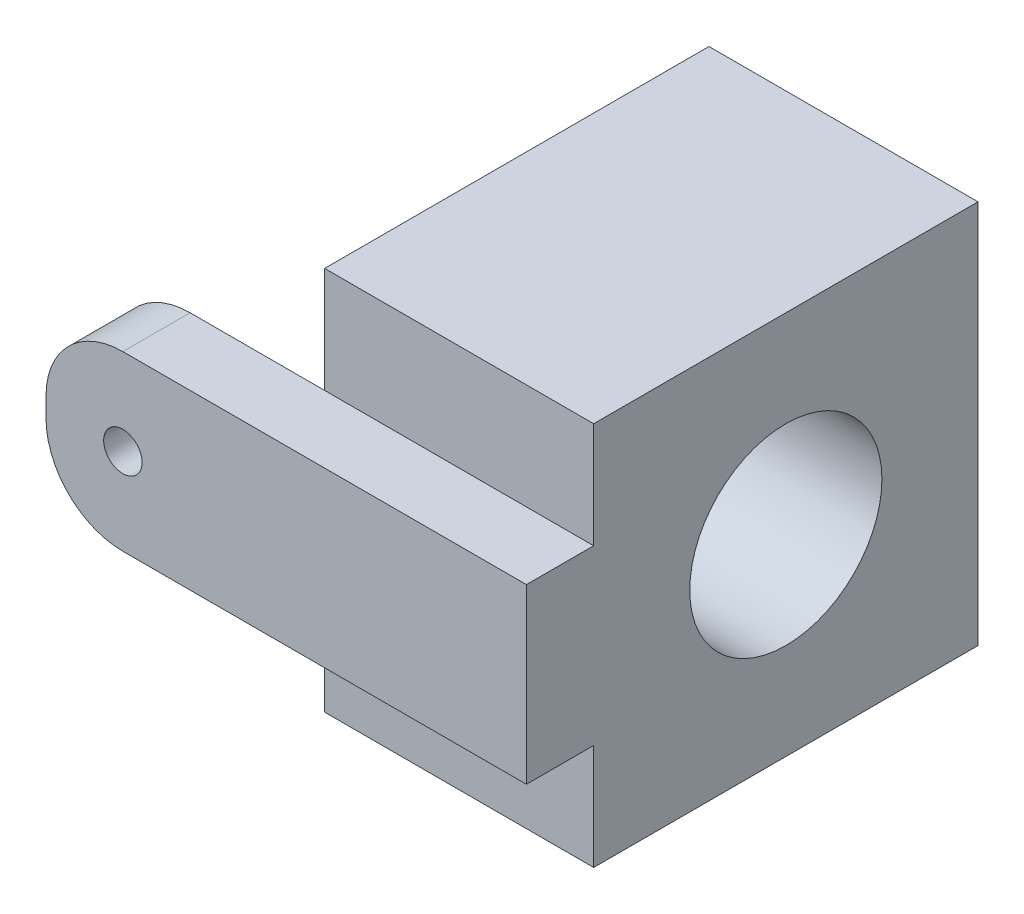
ISO-10303-21;
HEADER;
FILE_DESCRIPTION(('STEP AP214'),'2;1');
FILE_NAME('part.step','',(''),(''),'','','');
FILE_SCHEMA(('AUTOMOTIVE_DESIGN { 1 0 10303 214 1 1 1 1 }'));
ENDSEC;
DATA;
#1=APPLICATION_CONTEXT('core data for automotive mechanical design processes');
#2=APPLICATION_PROTOCOL_DEFINITION('international standard','automotive_design',2000,#1);
#3=PRODUCT_CONTEXT('',#1,'mechanical');
#4=PRODUCT('Part','Part','',(#3));
#5=PRODUCT_RELATED_PRODUCT_CATEGORY('part','',(#4));
#6=PRODUCT_DEFINITION_FORMATION('','',#4);
#7=PRODUCT_DEFINITION_CONTEXT('part definition',#1,'design');
#8=PRODUCT_DEFINITION('design','',#6,#7);
#9=PRODUCT_DEFINITION_SHAPE('','',#8);
#10=(LENGTH_UNIT() NAMED_UNIT(*) SI_UNIT(.MILLI.,.METRE.));
#11=(NAMED_UNIT(*) PLANE_ANGLE_UNIT() SI_UNIT($,.RADIAN.));
#12=(NAMED_UNIT(*) SI_UNIT($,.STERADIAN.) SOLID_ANGLE_UNIT());
#13=UNCERTAINTY_MEASURE_WITH_UNIT(LENGTH_MEASURE(1.E-05),#10,'distance_accuracy_value','');
#14=(GEOMETRIC_REPRESENTATION_CONTEXT(3) GLOBAL_UNCERTAINTY_ASSIGNED_CONTEXT((#13)) GLOBAL_UNIT_ASSIGNED_CONTEXT((#10,
#11,#12)) REPRESENTATION_CONTEXT('',''));
#15=CARTESIAN_POINT('',(0.,0.,0.));
#16=DIRECTION('',(0.,0.,1.));
#17=DIRECTION('',(1.,0.,0.));
#18=AXIS2_PLACEMENT_3D('',#15,#16,#17);
#19=CARTESIAN_POINT('',(14.,-20.,20.));
#20=DIRECTION('',(0.,0.,1.));
#21=DIRECTION('',(1.,0.,0.));
#22=AXIS2_PLACEMENT_3D('',#19,#20,#21);
#23=PLANE('',#22);
#24=DIRECTION('',(1.,0.,0.));
#25=VECTOR('',#24,1.);
#26=CARTESIAN_POINT('',(14.,-9.,20.));
#27=LINE('',#26,#25);
#28=CARTESIAN_POINT('',(-14.,-9.,20.));
#29=VERTEX_POINT('',#28);
#30=CARTESIAN_POINT('',(14.,-9.,20.));
#31=VERTEX_POINT('',#30);
#32=EDGE_CURVE('E199',#29,#31,#27,.T.);
#33=ORIENTED_EDGE('',*,*,#32,.F.);
#34=DIRECTION('',(0.,1.,0.));
#35=VECTOR('',#34,1.);
#36=CARTESIAN_POINT('',(-14.,-20.,20.));
#37=LINE('',#36,#35);
#38=CARTESIAN_POINT('',(-14.,-20.,20.));
#39=VERTEX_POINT('',#38);
#40=EDGE_CURVE('E200',#39,#29,#37,.T.);
#41=ORIENTED_EDGE('',*,*,#40,.F.);
#42=DIRECTION('',(1.,0.,0.));
#43=VECTOR('',#42,1.);
#44=CARTESIAN_POINT('',(14.,-20.,20.));
#45=LINE('',#44,#43);
#46=CARTESIAN_POINT('',(14.,-20.,20.));
#47=VERTEX_POINT('',#46);
#48=EDGE_CURVE('E191',#39,#47,#45,.T.);
#49=ORIENTED_EDGE('',*,*,#48,.T.);
#50=DIRECTION('',(0.,1.,0.));
#51=VECTOR('',#50,1.);
#52=CARTESIAN_POINT('',(14.,-20.,20.));
#53=LINE('',#52,#51);
#54=EDGE_CURVE('E196',#47,#31,#53,.T.);
#55=ORIENTED_EDGE('',*,*,#54,.T.);
#56=EDGE_LOOP('',(#33,#41,#49,#55));
#57=FACE_BOUND('',#56,.T.);
#58=ADVANCED_FACE('F39',(#57),#23,.T.);
#59=CARTESIAN_POINT('',(14.,-20.,-20.));
#60=DIRECTION('',(1.,0.,0.));
#61=DIRECTION('',(0.,0.,-1.));
#62=AXIS2_PLACEMENT_3D('',#59,#60,#61);
#63=PLANE('',#62);
#64=CARTESIAN_POINT('',(14.,0.,0.));
#65=DIRECTION('',(1.,0.,0.));
#66=DIRECTION('',(0.,0.,-1.));
#67=AXIS2_PLACEMENT_3D('',#64,#65,#66);
#68=CIRCLE('',#67,10.);
#69=CARTESIAN_POINT('',(14.,0.,-10.));
#70=VERTEX_POINT('',#69);
#71=EDGE_CURVE('E149',#70,#70,#68,.T.);
#72=ORIENTED_EDGE('',*,*,#71,.F.);
#73=EDGE_LOOP('',(#72));
#74=FACE_BOUND('',#73,.T.);
#75=DIRECTION('',(0.,1.,0.));
#76=VECTOR('',#75,1.);
#77=CARTESIAN_POINT('',(14.,-20.,-20.));
#78=LINE('',#77,#76);
#79=CARTESIAN_POINT('',(14.,-20.,-20.));
#80=VERTEX_POINT('',#79);
#81=CARTESIAN_POINT('',(14.,20.,-20.));
#82=VERTEX_POINT('',#81);
#83=EDGE_CURVE('E195',#80,#82,#78,.T.);
#84=ORIENTED_EDGE('',*,*,#83,.T.);
#85=DIRECTION('',(0.,0.,-1.));
#86=VECTOR('',#85,1.);
#87=CARTESIAN_POINT('',(14.,20.,-20.));
#88=LINE('',#87,#86);
#89=CARTESIAN_POINT('',(14.,20.,20.));
#90=VERTEX_POINT('',#89);
#91=EDGE_CURVE('E162',#90,#82,#88,.T.);
#92=ORIENTED_EDGE('',*,*,#91,.F.);
#93=CARTESIAN_POINT('',(14.,9.,20.));
#94=VERTEX_POINT('',#93);
#95=EDGE_CURVE('E147',#94,#90,#53,.T.);
#96=ORIENTED_EDGE('',*,*,#95,.F.);
#97=DIRECTION('',(0.,0.,-1.));
#98=VECTOR('',#97,1.);
#99=CARTESIAN_POINT('',(14.,9.,27.));
#100=LINE('',#99,#98);
#101=CARTESIAN_POINT('',(14.,9.,27.));
#102=VERTEX_POINT('',#101);
#103=EDGE_CURVE('E127',#102,#94,#100,.T.);
#104=ORIENTED_EDGE('',*,*,#103,.F.);
#105=DIRECTION('',(0.,1.,0.));
#106=VECTOR('',#105,1.);
#107=CARTESIAN_POINT('',(14.,9.,27.));
#108=LINE('',#107,#106);
#109=CARTESIAN_POINT('',(14.,-9.,27.));
#110=VERTEX_POINT('',#109);
#111=EDGE_CURVE('E132',#110,#102,#108,.T.);
#112=ORIENTED_EDGE('',*,*,#111,.F.);
#113=DIRECTION('',(0.,0.,-1.));
#114=VECTOR('',#113,1.);
#115=CARTESIAN_POINT('',(14.,-9.,27.));
#116=LINE('',#115,#114);
#117=EDGE_CURVE('E150',#110,#31,#116,.T.);
#118=ORIENTED_EDGE('',*,*,#117,.T.);
#119=ORIENTED_EDGE('',*,*,#54,.F.);
#120=DIRECTION('',(0.,0.,-1.));
#121=VECTOR('',#120,1.);
#122=CARTESIAN_POINT('',(14.,-20.,-20.));
#123=LINE('',#122,#121);
#124=EDGE_CURVE('E179',#47,#80,#123,.T.);
#125=ORIENTED_EDGE('',*,*,#124,.T.);
#126=EDGE_LOOP('',(#84,#92,#96,#104,#112,#118,#119,#125));
#127=FACE_BOUND('',#126,.T.);
#128=ADVANCED_FACE('F145',(#74,#127),#63,.T.);
#129=DIRECTION('',(-1.,0.,0.));
#130=VECTOR('',#129,1.);
#131=CARTESIAN_POINT('',(14.,9.,20.));
#132=LINE('',#131,#130);
#133=CARTESIAN_POINT('',(-14.,9.,20.));
#134=VERTEX_POINT('',#133);
#135=EDGE_CURVE('E248',#94,#134,#132,.T.);
#136=ORIENTED_EDGE('',*,*,#135,.F.);
#137=ORIENTED_EDGE('',*,*,#95,.T.);
#138=DIRECTION('',(1.,0.,0.));
#139=VECTOR('',#138,1.);
#140=CARTESIAN_POINT('',(14.,20.,20.));
#141=LINE('',#140,#139);
#142=CARTESIAN_POINT('',(-14.,20.,20.));
#143=VERTEX_POINT('',#142);
#144=EDGE_CURVE('E175',#143,#90,#141,.T.);
#145=ORIENTED_EDGE('',*,*,#144,.F.);
#146=EDGE_CURVE('E205',#134,#143,#37,.T.);
#147=ORIENTED_EDGE('',*,*,#146,.F.);
#148=EDGE_LOOP('',(#136,#137,#145,#147));
#149=FACE_BOUND('',#148,.T.);
#150=ADVANCED_FACE('F281',(#149),#23,.T.);
#151=CARTESIAN_POINT('',(-14.,-20.,-20.));
#152=DIRECTION('',(-1.,0.,0.));
#153=DIRECTION('',(0.,0.,1.));
#154=AXIS2_PLACEMENT_3D('',#151,#152,#153);
#155=PLANE('',#154);
#156=CARTESIAN_POINT('',(-14.,0.,0.));
#157=DIRECTION('',(1.,0.,0.));
#158=DIRECTION('',(0.,0.,-1.));
#159=AXIS2_PLACEMENT_3D('',#156,#157,#158);
#160=CIRCLE('',#159,10.);
#161=CARTESIAN_POINT('',(-14.,0.,-10.));
#162=VERTEX_POINT('',#161);
#163=EDGE_CURVE('E155',#162,#162,#160,.T.);
#164=ORIENTED_EDGE('',*,*,#163,.T.);
#165=EDGE_LOOP('',(#164));
#166=FACE_BOUND('',#165,.T.);
#167=ORIENTED_EDGE('',*,*,#40,.T.);
#168=EDGE_CURVE('E204',#29,#134,#37,.T.);
#169=ORIENTED_EDGE('',*,*,#168,.T.);
#170=ORIENTED_EDGE('',*,*,#146,.T.);
#171=DIRECTION('',(0.,0.,1.));
#172=VECTOR('',#171,1.);
#173=CARTESIAN_POINT('',(-14.,20.,-20.));
#174=LINE('',#173,#172);
#175=CARTESIAN_POINT('',(-14.,20.,-20.));
#176=VERTEX_POINT('',#175);
#177=EDGE_CURVE('E171',#176,#143,#174,.T.);
#178=ORIENTED_EDGE('',*,*,#177,.F.);
#179=DIRECTION('',(0.,1.,0.));
#180=VECTOR('',#179,1.);
#181=CARTESIAN_POINT('',(-14.,-20.,-20.));
#182=LINE('',#181,#180);
#183=CARTESIAN_POINT('',(-14.,-20.,-20.));
#184=VERTEX_POINT('',#183);
#185=EDGE_CURVE('E206',#184,#176,#182,.T.);
#186=ORIENTED_EDGE('',*,*,#185,.F.);
#187=DIRECTION('',(0.,0.,1.));
#188=VECTOR('',#187,1.);
#189=CARTESIAN_POINT('',(-14.,-20.,-20.));
#190=LINE('',#189,#188);
#191=EDGE_CURVE('E187',#184,#39,#190,.T.);
#192=ORIENTED_EDGE('',*,*,#191,.T.);
#193=EDGE_LOOP('',(#167,#169,#170,#178,#186,#192));
#194=FACE_BOUND('',#193,.T.);
#195=ADVANCED_FACE('F291',(#166,#194),#155,.T.);
#196=CARTESIAN_POINT('',(14.,-20.,-20.));
#197=DIRECTION('',(0.,0.,-1.));
#198=DIRECTION('',(-1.,0.,0.));
#199=AXIS2_PLACEMENT_3D('',#196,#197,#198);
#200=PLANE('',#199);
#201=ORIENTED_EDGE('',*,*,#185,.T.);
#202=DIRECTION('',(-1.,0.,0.));
#203=VECTOR('',#202,1.);
#204=CARTESIAN_POINT('',(14.,20.,-20.));
#205=LINE('',#204,#203);
#206=EDGE_CURVE('E167',#82,#176,#205,.T.);
#207=ORIENTED_EDGE('',*,*,#206,.F.);
#208=ORIENTED_EDGE('',*,*,#83,.F.);
#209=DIRECTION('',(-1.,0.,0.));
#210=VECTOR('',#209,1.);
#211=CARTESIAN_POINT('',(14.,-20.,-20.));
#212=LINE('',#211,#210);
#213=EDGE_CURVE('E183',#80,#184,#212,.T.);
#214=ORIENTED_EDGE('',*,*,#213,.T.);
#215=EDGE_LOOP('',(#201,#207,#208,#214));
#216=FACE_BOUND('',#215,.T.);
#217=ADVANCED_FACE('F296',(#216),#200,.T.);
#218=CARTESIAN_POINT('',(0.,-20.,0.));
#219=DIRECTION('',(0.,-1.,0.));
#220=DIRECTION('',(0.,0.,-1.));
#221=AXIS2_PLACEMENT_3D('',#218,#219,#220);
#222=PLANE('',#221);
#223=ORIENTED_EDGE('',*,*,#124,.F.);
#224=ORIENTED_EDGE('',*,*,#48,.F.);
#225=ORIENTED_EDGE('',*,*,#191,.F.);
#226=ORIENTED_EDGE('',*,*,#213,.F.);
#227=EDGE_LOOP('',(#223,#224,#225,#226));
#228=FACE_BOUND('',#227,.T.);
#229=ADVANCED_FACE('F311',(#228),#222,.T.);
#230=CARTESIAN_POINT('',(0.,20.,0.));
#231=DIRECTION('',(0.,-1.,0.));
#232=DIRECTION('',(0.,0.,-1.));
#233=AXIS2_PLACEMENT_3D('',#230,#231,#232);
#234=PLANE('',#233);
#235=ORIENTED_EDGE('',*,*,#91,.T.);
#236=ORIENTED_EDGE('',*,*,#206,.T.);
#237=ORIENTED_EDGE('',*,*,#177,.T.);
#238=ORIENTED_EDGE('',*,*,#144,.T.);
#239=EDGE_LOOP('',(#235,#236,#237,#238));
#240=FACE_BOUND('',#239,.T.);
#241=ADVANCED_FACE('F316',(#240),#234,.F.);
#242=CARTESIAN_POINT('',(-14.,0.,0.));
#243=DIRECTION('',(1.,0.,0.));
#244=DIRECTION('',(0.,0.,-1.));
#245=AXIS2_PLACEMENT_3D('',#242,#243,#244);
#246=CYLINDRICAL_SURFACE('',#245,10.);
#247=CARTESIAN_POINT('',(-14.,0.,-10.));
#248=CARTESIAN_POINT('',(-13.7083333333333,0.,-10.));
#249=CARTESIAN_POINT('',(-13.4166666666667,0.,-10.));
#250=CARTESIAN_POINT('',(-12.8333333333333,0.,-10.));
#251=CARTESIAN_POINT('',(-12.5416666666667,0.,-10.));
#252=CARTESIAN_POINT('',(-11.9583333333333,0.,-10.));
#253=CARTESIAN_POINT('',(-11.6666666666667,0.,-10.));
#254=CARTESIAN_POINT('',(-11.0833333333333,0.,-10.));
#255=CARTESIAN_POINT('',(-10.7916666666667,0.,-10.));
#256=CARTESIAN_POINT('',(-10.2083333333333,0.,-10.));
#257=CARTESIAN_POINT('',(-9.91666666666667,0.,-10.));
#258=CARTESIAN_POINT('',(-9.33333333333333,0.,-10.));
#259=CARTESIAN_POINT('',(-9.04166666666667,0.,-10.));
#260=CARTESIAN_POINT('',(-8.45833333333333,0.,-10.));
#261=CARTESIAN_POINT('',(-8.16666666666667,0.,-10.));
#262=CARTESIAN_POINT('',(-7.58333333333333,0.,-10.));
#263=CARTESIAN_POINT('',(-7.29166666666667,0.,-10.));
#264=CARTESIAN_POINT('',(-6.70833333333333,0.,-10.));
#265=CARTESIAN_POINT('',(-6.41666666666667,0.,-10.));
#266=CARTESIAN_POINT('',(-5.83333333333334,0.,-10.));
#267=CARTESIAN_POINT('',(-5.54166666666667,0.,-10.));
#268=CARTESIAN_POINT('',(-4.95833333333334,0.,-10.));
#269=CARTESIAN_POINT('',(-4.66666666666667,0.,-10.));
#270=CARTESIAN_POINT('',(-4.08333333333334,0.,-10.));
#271=CARTESIAN_POINT('',(-3.79166666666667,0.,-10.));
#272=CARTESIAN_POINT('',(-3.20833333333334,0.,-10.));
#273=CARTESIAN_POINT('',(-2.91666666666667,0.,-10.));
#274=CARTESIAN_POINT('',(-2.33333333333334,0.,-10.));
#275=CARTESIAN_POINT('',(-2.04166666666667,0.,-10.));
#276=CARTESIAN_POINT('',(-1.45833333333334,0.,-10.));
#277=CARTESIAN_POINT('',(-1.16666666666667,0.,-10.));
#278=CARTESIAN_POINT('',(-0.583333333333337,0.,-10.));
#279=CARTESIAN_POINT('',(-0.29166666666667,0.,-10.));
#280=CARTESIAN_POINT('',(0.291666666666663,0.,-10.));
#281=CARTESIAN_POINT('',(0.58333333333333,0.,-10.));
#282=CARTESIAN_POINT('',(1.16666666666666,0.,-10.));
#283=CARTESIAN_POINT('',(1.45833333333333,0.,-10.));
#284=CARTESIAN_POINT('',(2.04166666666666,0.,-10.));
#285=CARTESIAN_POINT('',(2.33333333333333,0.,-10.));
#286=CARTESIAN_POINT('',(2.91666666666666,0.,-10.));
#287=CARTESIAN_POINT('',(3.20833333333333,0.,-10.));
#288=CARTESIAN_POINT('',(3.79166666666666,0.,-10.));
#289=CARTESIAN_POINT('',(4.08333333333333,0.,-10.));
#290=CARTESIAN_POINT('',(4.66666666666666,0.,-10.));
#291=CARTESIAN_POINT('',(4.95833333333333,0.,-10.));
#292=CARTESIAN_POINT('',(5.54166666666666,0.,-10.));
#293=CARTESIAN_POINT('',(5.83333333333333,0.,-10.));
#294=CARTESIAN_POINT('',(6.41666666666666,0.,-10.));
#295=CARTESIAN_POINT('',(6.70833333333333,0.,-10.));
#296=CARTESIAN_POINT('',(7.29166666666666,0.,-10.));
#297=CARTESIAN_POINT('',(7.58333333333333,0.,-10.));
#298=CARTESIAN_POINT('',(8.16666666666666,0.,-10.));
#299=CARTESIAN_POINT('',(8.45833333333333,0.,-10.));
#300=CARTESIAN_POINT('',(9.04166666666666,0.,-10.));
#301=CARTESIAN_POINT('',(9.33333333333333,0.,-10.));
#302=CARTESIAN_POINT('',(9.91666666666666,0.,-10.));
#303=CARTESIAN_POINT('',(10.2083333333333,0.,-10.));
#304=CARTESIAN_POINT('',(10.7916666666667,0.,-10.));
#305=CARTESIAN_POINT('',(11.0833333333333,0.,-10.));
#306=CARTESIAN_POINT('',(11.6666666666667,0.,-10.));
#307=CARTESIAN_POINT('',(11.9583333333333,0.,-10.));
#308=CARTESIAN_POINT('',(12.5416666666667,0.,-10.));
#309=CARTESIAN_POINT('',(12.8333333333333,0.,-10.));
#310=CARTESIAN_POINT('',(13.4166666666667,0.,-10.));
#311=CARTESIAN_POINT('',(13.7083333333333,0.,-10.));
#312=CARTESIAN_POINT('',(14.,0.,-10.));
#313=B_SPLINE_CURVE_WITH_KNOTS('',3,(#247,#248,#249,#250,#251,#252,#253,#254,#255,#256,#257,
#258,#259,#260,#261,#262,#263,#264,#265,#266,#267,#268,#269,#270,#271,#272,#273,#274,#275,#276,
#277,#278,#279,#280,#281,#282,#283,#284,#285,#286,#287,#288,#289,#290,#291,#292,#293,#294,#295,
#296,#297,#298,#299,#300,#301,#302,#303,#304,#305,#306,#307,#308,#309,#310,#311,#312),
.UNSPECIFIED.,.F.,.F.,(4,2,2,2,2,2,2,2,2,2,2,2,2,2,2,2,2,2,2,2,2,2,2,2,2,2,2,2,2,2,2,2,4),(0.,
0.875000000000001,1.75,2.625,3.5,4.375,5.25,6.125,7.,7.875,8.75,9.625,10.5,11.375,12.25,13.125,
14.,14.875,15.75,16.625,17.5,18.375,19.25,20.125,21.,21.875,22.75,23.625,24.5,25.375,26.25,
27.125,28.),.UNSPECIFIED.);
#314=EDGE_CURVE('BSEAM331',#162,#70,#313,.T.);
#315=ORIENTED_EDGE('',*,*,#163,.F.);
#316=ORIENTED_EDGE('',*,*,#71,.T.);
#317=ORIENTED_EDGE('',*,*,#314,.T.);
#318=ORIENTED_EDGE('',*,*,#314,.F.);
#319=EDGE_LOOP('',(#315,#317,#316,#318));
#320=FACE_BOUND('',#319,.T.);
#321=ADVANCED_FACE('F331',(#320),#246,.F.);
#322=CARTESIAN_POINT('',(0.,0.,20.));
#323=DIRECTION('',(0.,0.,-1.));
#324=DIRECTION('',(-1.,0.,0.));
#325=AXIS2_PLACEMENT_3D('',#322,#323,#324);
#326=PLANE('',#325);
#327=CARTESIAN_POINT('',(-28.,0.,20.));
#328=DIRECTION('',(0.,0.,-1.));
#329=DIRECTION('',(-1.,0.,0.));
#330=AXIS2_PLACEMENT_3D('',#327,#328,#329);
#331=CIRCLE('',#330,2.);
#332=CARTESIAN_POINT('',(-30.,0.,20.));
#333=VERTEX_POINT('',#332);
#334=EDGE_CURVE('E257',#333,#333,#331,.T.);
#335=ORIENTED_EDGE('',*,*,#334,.F.);
#336=EDGE_LOOP('',(#335));
#337=FACE_BOUND('',#336,.T.);
#338=CARTESIAN_POINT('',(-28.,-9.,20.));
#339=VERTEX_POINT('',#338);
#340=EDGE_CURVE('E142',#339,#29,#27,.T.);
#341=ORIENTED_EDGE('',*,*,#340,.F.);
#342=CARTESIAN_POINT('',(-28.,-0.999999999999999,20.));
#343=DIRECTION('',(0.,0.,-1.));
#344=DIRECTION('',(-1.,0.,0.));
#345=AXIS2_PLACEMENT_3D('',#342,#343,#344);
#346=CIRCLE('',#345,8.);
#347=CARTESIAN_POINT('',(-36.,-0.999999999999999,20.));
#348=VERTEX_POINT('',#347);
#349=EDGE_CURVE('E218',#339,#348,#346,.T.);
#350=ORIENTED_EDGE('',*,*,#349,.T.);
#351=DIRECTION('',(0.,-1.,0.));
#352=VECTOR('',#351,1.);
#353=CARTESIAN_POINT('',(-36.,9.,20.));
#354=LINE('',#353,#352);
#355=CARTESIAN_POINT('',(-36.,0.999999999999999,20.));
#356=VERTEX_POINT('',#355);
#357=EDGE_CURVE('E243',#356,#348,#354,.T.);
#358=ORIENTED_EDGE('',*,*,#357,.F.);
#359=CARTESIAN_POINT('',(-28.,0.999999999999999,20.));
#360=DIRECTION('',(0.,0.,-1.));
#361=DIRECTION('',(-1.,0.,0.));
#362=AXIS2_PLACEMENT_3D('',#359,#360,#361);
#363=CIRCLE('',#362,8.);
#364=CARTESIAN_POINT('',(-28.,9.,20.));
#365=VERTEX_POINT('',#364);
#366=EDGE_CURVE('E215',#356,#365,#363,.T.);
#367=ORIENTED_EDGE('',*,*,#366,.T.);
#368=EDGE_CURVE('E252',#134,#365,#132,.T.);
#369=ORIENTED_EDGE('',*,*,#368,.F.);
#370=ORIENTED_EDGE('',*,*,#168,.F.);
#371=EDGE_LOOP('',(#341,#350,#358,#367,#369,#370));
#372=FACE_BOUND('',#371,.T.);
#373=ADVANCED_FACE('F242',(#337,#372),#326,.T.);
#374=CARTESIAN_POINT('',(14.,9.,27.));
#375=DIRECTION('',(0.,-1.,0.));
#376=DIRECTION('',(0.,0.,-1.));
#377=AXIS2_PLACEMENT_3D('',#374,#375,#376);
#378=PLANE('',#377);
#379=ORIENTED_EDGE('',*,*,#368,.T.);
#380=DIRECTION('',(0.,0.,-1.));
#381=VECTOR('',#380,1.);
#382=CARTESIAN_POINT('',(-28.,9.,27.));
#383=LINE('',#382,#381);
#384=CARTESIAN_POINT('',(-28.,9.,27.));
#385=VERTEX_POINT('',#384);
#386=EDGE_CURVE('E11',#365,#385,#383,.F.);
#387=ORIENTED_EDGE('',*,*,#386,.T.);
#388=DIRECTION('',(-1.,0.,0.));
#389=VECTOR('',#388,1.);
#390=CARTESIAN_POINT('',(14.,9.,27.));
#391=LINE('',#390,#389);
#392=EDGE_CURVE('E122',#102,#385,#391,.T.);
#393=ORIENTED_EDGE('',*,*,#392,.F.);
#394=ORIENTED_EDGE('',*,*,#103,.T.);
#395=ORIENTED_EDGE('',*,*,#135,.T.);
#396=EDGE_LOOP('',(#379,#387,#393,#394,#395));
#397=FACE_BOUND('',#396,.T.);
#398=ADVANCED_FACE('F124',(#397),#378,.F.);
#399=CARTESIAN_POINT('',(-36.,9.,27.));
#400=DIRECTION('',(1.,0.,0.));
#401=DIRECTION('',(0.,0.,-1.));
#402=AXIS2_PLACEMENT_3D('',#399,#400,#401);
#403=PLANE('',#402);
#404=ORIENTED_EDGE('',*,*,#357,.T.);
#405=DIRECTION('',(0.,0.,-1.));
#406=VECTOR('',#405,1.);
#407=CARTESIAN_POINT('',(-36.,-0.999999999999999,27.));
#408=LINE('',#407,#406);
#409=CARTESIAN_POINT('',(-36.,-0.999999999999999,27.));
#410=VERTEX_POINT('',#409);
#411=EDGE_CURVE('E61',#348,#410,#408,.F.);
#412=ORIENTED_EDGE('',*,*,#411,.T.);
#413=DIRECTION('',(0.,-1.,0.));
#414=VECTOR('',#413,1.);
#415=CARTESIAN_POINT('',(-36.,9.,27.));
#416=LINE('',#415,#414);
#417=CARTESIAN_POINT('',(-36.,0.999999999999999,27.));
#418=VERTEX_POINT('',#417);
#419=EDGE_CURVE('E131',#418,#410,#416,.T.);
#420=ORIENTED_EDGE('',*,*,#419,.F.);
#421=DIRECTION('',(0.,0.,-1.));
#422=VECTOR('',#421,1.);
#423=CARTESIAN_POINT('',(-36.,0.999999999999999,27.));
#424=LINE('',#423,#422);
#425=EDGE_CURVE('E221',#418,#356,#424,.T.);
#426=ORIENTED_EDGE('',*,*,#425,.T.);
#427=EDGE_LOOP('',(#404,#412,#420,#426));
#428=FACE_BOUND('',#427,.T.);
#429=ADVANCED_FACE('F245',(#428),#403,.F.);
#430=CARTESIAN_POINT('',(14.,-9.,27.));
#431=DIRECTION('',(0.,1.,0.));
#432=DIRECTION('',(0.,0.,1.));
#433=AXIS2_PLACEMENT_3D('',#430,#431,#432);
#434=PLANE('',#433);
#435=DIRECTION('',(1.,0.,0.));
#436=VECTOR('',#435,1.);
#437=CARTESIAN_POINT('',(14.,-9.,27.));
#438=LINE('',#437,#436);
#439=CARTESIAN_POINT('',(-28.,-9.,27.));
#440=VERTEX_POINT('',#439);
#441=EDGE_CURVE('E137',#440,#110,#438,.T.);
#442=ORIENTED_EDGE('',*,*,#441,.F.);
#443=DIRECTION('',(0.,0.,-1.));
#444=VECTOR('',#443,1.);
#445=CARTESIAN_POINT('',(-28.,-9.,27.));
#446=LINE('',#445,#444);
#447=EDGE_CURVE('E211',#440,#339,#446,.T.);
#448=ORIENTED_EDGE('',*,*,#447,.T.);
#449=ORIENTED_EDGE('',*,*,#340,.T.);
#450=ORIENTED_EDGE('',*,*,#32,.T.);
#451=ORIENTED_EDGE('',*,*,#117,.F.);
#452=EDGE_LOOP('',(#442,#448,#449,#450,#451));
#453=FACE_BOUND('',#452,.T.);
#454=ADVANCED_FACE('F234',(#453),#434,.F.);
#455=CARTESIAN_POINT('',(0.,0.,27.));
#456=DIRECTION('',(0.,0.,-1.));
#457=DIRECTION('',(-1.,0.,0.));
#458=AXIS2_PLACEMENT_3D('',#455,#456,#457);
#459=PLANE('',#458);
#460=CARTESIAN_POINT('',(-28.,0.,27.));
#461=DIRECTION('',(0.,0.,1.));
#462=DIRECTION('',(1.,0.,0.));
#463=AXIS2_PLACEMENT_3D('',#460,#461,#462);
#464=CIRCLE('',#463,2.);
#465=CARTESIAN_POINT('',(-26.,0.,27.));
#466=VERTEX_POINT('',#465);
#467=EDGE_CURVE('E261',#466,#466,#464,.T.);
#468=ORIENTED_EDGE('',*,*,#467,.F.);
#469=EDGE_LOOP('',(#468));
#470=FACE_BOUND('',#469,.T.);
#471=ORIENTED_EDGE('',*,*,#419,.T.);
#472=CARTESIAN_POINT('',(-28.,-0.999999999999999,27.));
#473=DIRECTION('',(0.,0.,-1.));
#474=DIRECTION('',(-1.,0.,0.));
#475=AXIS2_PLACEMENT_3D('',#472,#473,#474);
#476=CIRCLE('',#475,8.);
#477=EDGE_CURVE('E48',#410,#440,#476,.F.);
#478=ORIENTED_EDGE('',*,*,#477,.T.);
#479=ORIENTED_EDGE('',*,*,#441,.T.);
#480=ORIENTED_EDGE('',*,*,#111,.T.);
#481=ORIENTED_EDGE('',*,*,#392,.T.);
#482=CARTESIAN_POINT('',(-28.,0.999999999999999,27.));
#483=DIRECTION('',(0.,0.,-1.));
#484=DIRECTION('',(-1.,0.,0.));
#485=AXIS2_PLACEMENT_3D('',#482,#483,#484);
#486=CIRCLE('',#485,8.);
#487=EDGE_CURVE('E227',#385,#418,#486,.F.);
#488=ORIENTED_EDGE('',*,*,#487,.T.);
#489=EDGE_LOOP('',(#471,#478,#479,#480,#481,#488));
#490=FACE_BOUND('',#489,.T.);
#491=ADVANCED_FACE('F135',(#470,#490),#459,.F.);
#492=CARTESIAN_POINT('',(-28.,0.,-20.));
#493=DIRECTION('',(0.,0.,1.));
#494=DIRECTION('',(1.,0.,0.));
#495=AXIS2_PLACEMENT_3D('',#492,#493,#494);
#496=CYLINDRICAL_SURFACE('',#495,2.);
#497=ORIENTED_EDGE('',*,*,#334,.T.);
#498=EDGE_LOOP('',(#497));
#499=FACE_BOUND('',#498,.T.);
#500=ORIENTED_EDGE('',*,*,#467,.T.);
#501=EDGE_LOOP('',(#500));
#502=FACE_BOUND('',#501,.T.);
#503=ADVANCED_FACE('F266',(#499,#502),#496,.F.);
#504=CARTESIAN_POINT('',(-28.,-0.999999999999999,27.));
#505=DIRECTION('',(0.,0.,-1.));
#506=DIRECTION('',(-1.,0.,0.));
#507=AXIS2_PLACEMENT_3D('',#504,#505,#506);
#508=CYLINDRICAL_SURFACE('',#507,8.);
#509=ORIENTED_EDGE('',*,*,#477,.F.);
#510=ORIENTED_EDGE('',*,*,#411,.F.);
#511=ORIENTED_EDGE('',*,*,#349,.F.);
#512=ORIENTED_EDGE('',*,*,#447,.F.);
#513=EDGE_LOOP('',(#509,#510,#511,#512));
#514=FACE_BOUND('',#513,.T.);
#515=ADVANCED_FACE('F239',(#514),#508,.T.);
#516=CARTESIAN_POINT('',(-28.,0.999999999999999,27.));
#517=DIRECTION('',(0.,0.,-1.));
#518=DIRECTION('',(-1.,0.,0.));
#519=AXIS2_PLACEMENT_3D('',#516,#517,#518);
#520=CYLINDRICAL_SURFACE('',#519,8.);
#521=ORIENTED_EDGE('',*,*,#487,.F.);
#522=ORIENTED_EDGE('',*,*,#386,.F.);
#523=ORIENTED_EDGE('',*,*,#366,.F.);
#524=ORIENTED_EDGE('',*,*,#425,.F.);
#525=EDGE_LOOP('',(#521,#522,#523,#524));
#526=FACE_BOUND('',#525,.T.);
#527=ADVANCED_FACE('F41',(#526),#520,.T.);
#528=CLOSED_SHELL('',(#58,#128,#150,#195,#217,#229,#241,#321,#373,#398,#429,#454,#491,#503,#515,#527));
#529=MANIFOLD_SOLID_BREP('B2',#528);
#530=ADVANCED_BREP_SHAPE_REPRESENTATION('',(#18,#529),#14);
#531=SHAPE_DEFINITION_REPRESENTATION(#9,#530);
ENDSEC;
END-ISO-10303-21;
